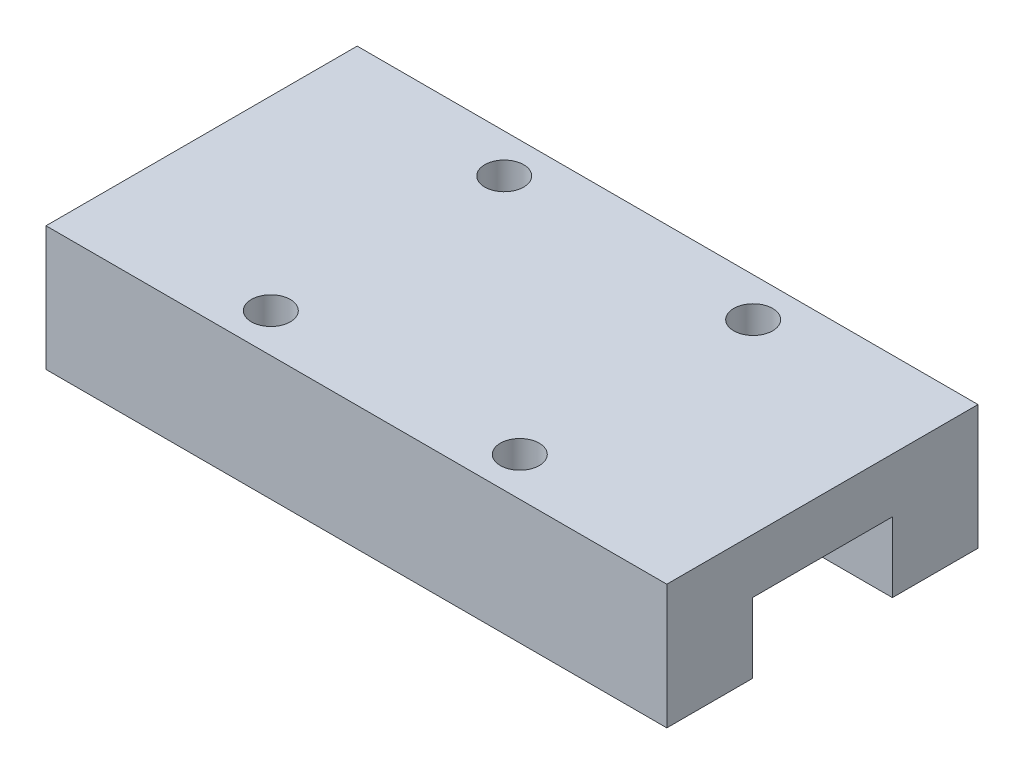
ISO-10303-21;
HEADER;
FILE_DESCRIPTION(('STEP AP214'),'2;1');
FILE_NAME('part.step','',(''),(''),'','','');
FILE_SCHEMA(('AUTOMOTIVE_DESIGN { 1 0 10303 214 1 1 1 1 }'));
ENDSEC;
DATA;
#1=APPLICATION_CONTEXT('core data for automotive mechanical design processes');
#2=APPLICATION_PROTOCOL_DEFINITION('international standard','automotive_design',2000,#1);
#3=PRODUCT_CONTEXT('',#1,'mechanical');
#4=PRODUCT('Part','Part','',(#3));
#5=PRODUCT_RELATED_PRODUCT_CATEGORY('part','',(#4));
#6=PRODUCT_DEFINITION_FORMATION('','',#4);
#7=PRODUCT_DEFINITION_CONTEXT('part definition',#1,'design');
#8=PRODUCT_DEFINITION('design','',#6,#7);
#9=PRODUCT_DEFINITION_SHAPE('','',#8);
#10=(LENGTH_UNIT() NAMED_UNIT(*) SI_UNIT(.MILLI.,.METRE.));
#11=(NAMED_UNIT(*) PLANE_ANGLE_UNIT() SI_UNIT($,.RADIAN.));
#12=(NAMED_UNIT(*) SI_UNIT($,.STERADIAN.) SOLID_ANGLE_UNIT());
#13=UNCERTAINTY_MEASURE_WITH_UNIT(LENGTH_MEASURE(1.E-05),#10,'distance_accuracy_value','');
#14=(GEOMETRIC_REPRESENTATION_CONTEXT(3) GLOBAL_UNCERTAINTY_ASSIGNED_CONTEXT((#13)) GLOBAL_UNIT_ASSIGNED_CONTEXT((#10,
#11,#12)) REPRESENTATION_CONTEXT('',''));
#15=CARTESIAN_POINT('',(0.,0.,0.));
#16=DIRECTION('',(0.,0.,1.));
#17=DIRECTION('',(1.,0.,0.));
#18=AXIS2_PLACEMENT_3D('',#15,#16,#17);
#19=CARTESIAN_POINT('',(19.95,0.,-5.5));
#20=DIRECTION('',(0.,1.,0.));
#21=DIRECTION('',(0.,0.,1.));
#22=AXIS2_PLACEMENT_3D('',#19,#20,#21);
#23=PLANE('',#22);
#24=DIRECTION('',(0.,0.,-1.));
#25=VECTOR('',#24,1.);
#26=CARTESIAN_POINT('',(-19.95,0.,-5.5));
#27=LINE('',#26,#25);
#28=CARTESIAN_POINT('',(-19.95,0.,0.));
#29=VERTEX_POINT('',#28);
#30=CARTESIAN_POINT('',(-19.95,0.,-5.5));
#31=VERTEX_POINT('',#30);
#32=EDGE_CURVE('E146',#29,#31,#27,.T.);
#33=ORIENTED_EDGE('',*,*,#32,.T.);
#34=DIRECTION('',(-1.,0.,0.));
#35=VECTOR('',#34,1.);
#36=CARTESIAN_POINT('',(19.95,0.,-5.5));
#37=LINE('',#36,#35);
#38=CARTESIAN_POINT('',(19.95,0.,-5.5));
#39=VERTEX_POINT('',#38);
#40=EDGE_CURVE('E11',#39,#31,#37,.T.);
#41=ORIENTED_EDGE('',*,*,#40,.F.);
#42=DIRECTION('',(0.,0.,-1.));
#43=VECTOR('',#42,1.);
#44=CARTESIAN_POINT('',(19.95,0.,-5.5));
#45=LINE('',#44,#43);
#46=CARTESIAN_POINT('',(19.95,0.,0.));
#47=VERTEX_POINT('',#46);
#48=EDGE_CURVE('E161',#47,#39,#45,.T.);
#49=ORIENTED_EDGE('',*,*,#48,.F.);
#50=DIRECTION('',(-1.,0.,0.));
#51=VECTOR('',#50,1.);
#52=CARTESIAN_POINT('',(19.95,0.,0.));
#53=LINE('',#52,#51);
#54=EDGE_CURVE('E142',#47,#29,#53,.T.);
#55=ORIENTED_EDGE('',*,*,#54,.T.);
#56=EDGE_LOOP('',(#33,#41,#49,#55));
#57=FACE_BOUND('',#56,.T.);
#58=ADVANCED_FACE('F47',(#57),#23,.F.);
#59=CARTESIAN_POINT('',(19.95,4.5,-5.5));
#60=DIRECTION('',(0.,0.,1.));
#61=DIRECTION('',(0.,-1.,0.));
#62=AXIS2_PLACEMENT_3D('',#59,#60,#61);
#63=PLANE('',#62);
#64=DIRECTION('',(0.,1.,0.));
#65=VECTOR('',#64,1.);
#66=CARTESIAN_POINT('',(-19.95,4.5,-5.5));
#67=LINE('',#66,#65);
#68=CARTESIAN_POINT('',(-19.95,4.5,-5.5));
#69=VERTEX_POINT('',#68);
#70=EDGE_CURVE('E149',#31,#69,#67,.T.);
#71=ORIENTED_EDGE('',*,*,#70,.T.);
#72=DIRECTION('',(-1.,0.,0.));
#73=VECTOR('',#72,1.);
#74=CARTESIAN_POINT('',(19.95,4.5,-5.5));
#75=LINE('',#74,#73);
#76=CARTESIAN_POINT('',(19.95,4.5,-5.5));
#77=VERTEX_POINT('',#76);
#78=EDGE_CURVE('E55',#77,#69,#75,.T.);
#79=ORIENTED_EDGE('',*,*,#78,.F.);
#80=DIRECTION('',(0.,1.,0.));
#81=VECTOR('',#80,1.);
#82=CARTESIAN_POINT('',(19.95,4.5,-5.5));
#83=LINE('',#82,#81);
#84=EDGE_CURVE('E107',#39,#77,#83,.T.);
#85=ORIENTED_EDGE('',*,*,#84,.F.);
#86=ORIENTED_EDGE('',*,*,#40,.T.);
#87=EDGE_LOOP('',(#71,#79,#85,#86));
#88=FACE_BOUND('',#87,.T.);
#89=ADVANCED_FACE('F248',(#88),#63,.F.);
#90=CARTESIAN_POINT('',(19.95,4.5,-14.5));
#91=DIRECTION('',(0.,1.,0.));
#92=DIRECTION('',(0.,0.,1.));
#93=AXIS2_PLACEMENT_3D('',#90,#91,#92);
#94=PLANE('',#93);
#95=DIRECTION('',(0.,0.,-1.));
#96=VECTOR('',#95,1.);
#97=CARTESIAN_POINT('',(-19.95,4.5,-14.5));
#98=LINE('',#97,#96);
#99=CARTESIAN_POINT('',(-19.95,4.5,-14.5));
#100=VERTEX_POINT('',#99);
#101=EDGE_CURVE('E152',#69,#100,#98,.T.);
#102=ORIENTED_EDGE('',*,*,#101,.T.);
#103=DIRECTION('',(-1.,0.,0.));
#104=VECTOR('',#103,1.);
#105=CARTESIAN_POINT('',(19.95,4.5,-14.5));
#106=LINE('',#105,#104);
#107=CARTESIAN_POINT('',(19.95,4.5,-14.5));
#108=VERTEX_POINT('',#107);
#109=EDGE_CURVE('E168',#108,#100,#106,.T.);
#110=ORIENTED_EDGE('',*,*,#109,.F.);
#111=DIRECTION('',(0.,0.,-1.));
#112=VECTOR('',#111,1.);
#113=CARTESIAN_POINT('',(19.95,4.5,-14.5));
#114=LINE('',#113,#112);
#115=EDGE_CURVE('E176',#77,#108,#114,.T.);
#116=ORIENTED_EDGE('',*,*,#115,.F.);
#117=ORIENTED_EDGE('',*,*,#78,.T.);
#118=EDGE_LOOP('',(#102,#110,#116,#117));
#119=FACE_BOUND('',#118,.T.);
#120=ADVANCED_FACE('F174',(#119),#94,.F.);
#121=CARTESIAN_POINT('',(19.95,0.,-14.5));
#122=DIRECTION('',(0.,0.,-1.));
#123=DIRECTION('',(-1.,0.,0.));
#124=AXIS2_PLACEMENT_3D('',#121,#122,#123);
#125=PLANE('',#124);
#126=DIRECTION('',(0.,-1.,0.));
#127=VECTOR('',#126,1.);
#128=CARTESIAN_POINT('',(-19.95,0.,-14.5));
#129=LINE('',#128,#127);
#130=CARTESIAN_POINT('',(-19.95,0.,-14.5));
#131=VERTEX_POINT('',#130);
#132=EDGE_CURVE('E154',#100,#131,#129,.T.);
#133=ORIENTED_EDGE('',*,*,#132,.T.);
#134=DIRECTION('',(-1.,0.,0.));
#135=VECTOR('',#134,1.);
#136=CARTESIAN_POINT('',(19.95,0.,-14.5));
#137=LINE('',#136,#135);
#138=CARTESIAN_POINT('',(19.95,0.,-14.5));
#139=VERTEX_POINT('',#138);
#140=EDGE_CURVE('E165',#139,#131,#137,.T.);
#141=ORIENTED_EDGE('',*,*,#140,.F.);
#142=DIRECTION('',(0.,-1.,0.));
#143=VECTOR('',#142,1.);
#144=CARTESIAN_POINT('',(19.95,0.,-14.5));
#145=LINE('',#144,#143);
#146=EDGE_CURVE('E188',#108,#139,#145,.T.);
#147=ORIENTED_EDGE('',*,*,#146,.F.);
#148=ORIENTED_EDGE('',*,*,#109,.T.);
#149=EDGE_LOOP('',(#133,#141,#147,#148));
#150=FACE_BOUND('',#149,.T.);
#151=ADVANCED_FACE('F184',(#150),#125,.F.);
#152=CARTESIAN_POINT('',(19.95,0.,-20.));
#153=DIRECTION('',(0.,1.,0.));
#154=DIRECTION('',(0.,0.,1.));
#155=AXIS2_PLACEMENT_3D('',#152,#153,#154);
#156=PLANE('',#155);
#157=DIRECTION('',(0.,0.,-1.));
#158=VECTOR('',#157,1.);
#159=CARTESIAN_POINT('',(-19.95,0.,-20.));
#160=LINE('',#159,#158);
#161=CARTESIAN_POINT('',(-19.95,0.,-20.));
#162=VERTEX_POINT('',#161);
#163=EDGE_CURVE('E156',#131,#162,#160,.T.);
#164=ORIENTED_EDGE('',*,*,#163,.T.);
#165=DIRECTION('',(-1.,0.,0.));
#166=VECTOR('',#165,1.);
#167=CARTESIAN_POINT('',(19.95,0.,-20.));
#168=LINE('',#167,#166);
#169=CARTESIAN_POINT('',(19.95,0.,-20.));
#170=VERTEX_POINT('',#169);
#171=EDGE_CURVE('E137',#170,#162,#168,.T.);
#172=ORIENTED_EDGE('',*,*,#171,.F.);
#173=DIRECTION('',(0.,0.,-1.));
#174=VECTOR('',#173,1.);
#175=CARTESIAN_POINT('',(19.95,0.,-20.));
#176=LINE('',#175,#174);
#177=EDGE_CURVE('E128',#139,#170,#176,.T.);
#178=ORIENTED_EDGE('',*,*,#177,.F.);
#179=ORIENTED_EDGE('',*,*,#140,.T.);
#180=EDGE_LOOP('',(#164,#172,#178,#179));
#181=FACE_BOUND('',#180,.T.);
#182=ADVANCED_FACE('F187',(#181),#156,.F.);
#183=CARTESIAN_POINT('',(19.95,8.,-20.));
#184=DIRECTION('',(0.,0.,1.));
#185=DIRECTION('',(0.,-1.,0.));
#186=AXIS2_PLACEMENT_3D('',#183,#184,#185);
#187=PLANE('',#186);
#188=DIRECTION('',(0.,1.,0.));
#189=VECTOR('',#188,1.);
#190=CARTESIAN_POINT('',(-19.95,8.,-20.));
#191=LINE('',#190,#189);
#192=CARTESIAN_POINT('',(-19.95,8.,-20.));
#193=VERTEX_POINT('',#192);
#194=EDGE_CURVE('E136',#162,#193,#191,.T.);
#195=ORIENTED_EDGE('',*,*,#194,.T.);
#196=DIRECTION('',(-1.,0.,0.));
#197=VECTOR('',#196,1.);
#198=CARTESIAN_POINT('',(19.95,8.,-20.));
#199=LINE('',#198,#197);
#200=CARTESIAN_POINT('',(19.95,8.,-20.));
#201=VERTEX_POINT('',#200);
#202=EDGE_CURVE('E133',#201,#193,#199,.T.);
#203=ORIENTED_EDGE('',*,*,#202,.F.);
#204=DIRECTION('',(0.,1.,0.));
#205=VECTOR('',#204,1.);
#206=CARTESIAN_POINT('',(19.95,8.,-20.));
#207=LINE('',#206,#205);
#208=EDGE_CURVE('E122',#170,#201,#207,.T.);
#209=ORIENTED_EDGE('',*,*,#208,.F.);
#210=ORIENTED_EDGE('',*,*,#171,.T.);
#211=EDGE_LOOP('',(#195,#203,#209,#210));
#212=FACE_BOUND('',#211,.T.);
#213=ADVANCED_FACE('F134',(#212),#187,.F.);
#214=CARTESIAN_POINT('',(19.95,8.,0.));
#215=DIRECTION('',(0.,-1.,0.));
#216=DIRECTION('',(0.,0.,-1.));
#217=AXIS2_PLACEMENT_3D('',#214,#215,#216);
#218=PLANE('',#217);
#219=CARTESIAN_POINT('',(-8.,8.,-17.5));
#220=DIRECTION('',(0.,1.,0.));
#221=DIRECTION('',(0.,0.,1.));
#222=AXIS2_PLACEMENT_3D('',#219,#220,#221);
#223=CIRCLE('',#222,1.25);
#224=CARTESIAN_POINT('',(-8.,8.,-16.25));
#225=VERTEX_POINT('',#224);
#226=EDGE_CURVE('E214',#225,#225,#223,.T.);
#227=ORIENTED_EDGE('',*,*,#226,.F.);
#228=EDGE_LOOP('',(#227));
#229=FACE_BOUND('',#228,.T.);
#230=CARTESIAN_POINT('',(8.,8.,-17.5));
#231=DIRECTION('',(0.,1.,0.));
#232=DIRECTION('',(0.,0.,1.));
#233=AXIS2_PLACEMENT_3D('',#230,#231,#232);
#234=CIRCLE('',#233,1.25);
#235=CARTESIAN_POINT('',(8.,8.,-16.25));
#236=VERTEX_POINT('',#235);
#237=EDGE_CURVE('E208',#236,#236,#234,.T.);
#238=ORIENTED_EDGE('',*,*,#237,.F.);
#239=EDGE_LOOP('',(#238));
#240=FACE_BOUND('',#239,.T.);
#241=CARTESIAN_POINT('',(8.,8.,-2.5));
#242=DIRECTION('',(0.,1.,0.));
#243=DIRECTION('',(0.,0.,1.));
#244=AXIS2_PLACEMENT_3D('',#241,#242,#243);
#245=CIRCLE('',#244,1.25);
#246=CARTESIAN_POINT('',(8.,8.,-1.25));
#247=VERTEX_POINT('',#246);
#248=EDGE_CURVE('E202',#247,#247,#245,.T.);
#249=ORIENTED_EDGE('',*,*,#248,.F.);
#250=EDGE_LOOP('',(#249));
#251=FACE_BOUND('',#250,.T.);
#252=CARTESIAN_POINT('',(-8.,8.,-2.5));
#253=DIRECTION('',(0.,1.,0.));
#254=DIRECTION('',(0.,0.,1.));
#255=AXIS2_PLACEMENT_3D('',#252,#253,#254);
#256=CIRCLE('',#255,1.25);
#257=CARTESIAN_POINT('',(-8.,8.,-1.25));
#258=VERTEX_POINT('',#257);
#259=EDGE_CURVE('E196',#258,#258,#256,.T.);
#260=ORIENTED_EDGE('',*,*,#259,.F.);
#261=EDGE_LOOP('',(#260));
#262=FACE_BOUND('',#261,.T.);
#263=DIRECTION('',(0.,0.,1.));
#264=VECTOR('',#263,1.);
#265=CARTESIAN_POINT('',(-19.95,8.,0.));
#266=LINE('',#265,#264);
#267=CARTESIAN_POINT('',(-19.95,8.,0.));
#268=VERTEX_POINT('',#267);
#269=EDGE_CURVE('E93',#193,#268,#266,.T.);
#270=ORIENTED_EDGE('',*,*,#269,.T.);
#271=DIRECTION('',(-1.,0.,0.));
#272=VECTOR('',#271,1.);
#273=CARTESIAN_POINT('',(19.95,8.,0.));
#274=LINE('',#273,#272);
#275=CARTESIAN_POINT('',(19.95,8.,0.));
#276=VERTEX_POINT('',#275);
#277=EDGE_CURVE('E138',#276,#268,#274,.T.);
#278=ORIENTED_EDGE('',*,*,#277,.F.);
#279=DIRECTION('',(0.,0.,1.));
#280=VECTOR('',#279,1.);
#281=CARTESIAN_POINT('',(19.95,8.,0.));
#282=LINE('',#281,#280);
#283=EDGE_CURVE('E126',#201,#276,#282,.T.);
#284=ORIENTED_EDGE('',*,*,#283,.F.);
#285=ORIENTED_EDGE('',*,*,#202,.T.);
#286=EDGE_LOOP('',(#270,#278,#284,#285));
#287=FACE_BOUND('',#286,.T.);
#288=ADVANCED_FACE('F140',(#229,#240,#251,#262,#287),#218,.F.);
#289=CARTESIAN_POINT('',(19.95,0.,0.));
#290=DIRECTION('',(0.,0.,-1.));
#291=DIRECTION('',(-1.,0.,0.));
#292=AXIS2_PLACEMENT_3D('',#289,#290,#291);
#293=PLANE('',#292);
#294=DIRECTION('',(0.,-1.,0.));
#295=VECTOR('',#294,1.);
#296=CARTESIAN_POINT('',(-19.95,0.,0.));
#297=LINE('',#296,#295);
#298=EDGE_CURVE('E99',#268,#29,#297,.T.);
#299=ORIENTED_EDGE('',*,*,#298,.T.);
#300=ORIENTED_EDGE('',*,*,#54,.F.);
#301=DIRECTION('',(0.,-1.,0.));
#302=VECTOR('',#301,1.);
#303=CARTESIAN_POINT('',(19.95,0.,0.));
#304=LINE('',#303,#302);
#305=EDGE_CURVE('E63',#276,#47,#304,.T.);
#306=ORIENTED_EDGE('',*,*,#305,.F.);
#307=ORIENTED_EDGE('',*,*,#277,.T.);
#308=EDGE_LOOP('',(#299,#300,#306,#307));
#309=FACE_BOUND('',#308,.T.);
#310=ADVANCED_FACE('F222',(#309),#293,.F.);
#311=CARTESIAN_POINT('',(19.95,0.,0.));
#312=DIRECTION('',(-1.,0.,0.));
#313=DIRECTION('',(0.,0.,1.));
#314=AXIS2_PLACEMENT_3D('',#311,#312,#313);
#315=PLANE('',#314);
#316=ORIENTED_EDGE('',*,*,#48,.T.);
#317=ORIENTED_EDGE('',*,*,#84,.T.);
#318=ORIENTED_EDGE('',*,*,#115,.T.);
#319=ORIENTED_EDGE('',*,*,#146,.T.);
#320=ORIENTED_EDGE('',*,*,#177,.T.);
#321=ORIENTED_EDGE('',*,*,#208,.T.);
#322=ORIENTED_EDGE('',*,*,#283,.T.);
#323=ORIENTED_EDGE('',*,*,#305,.T.);
#324=EDGE_LOOP('',(#316,#317,#318,#319,#320,#321,#322,#323));
#325=FACE_BOUND('',#324,.T.);
#326=ADVANCED_FACE('F124',(#325),#315,.F.);
#327=CARTESIAN_POINT('',(-19.95,0.,0.));
#328=DIRECTION('',(-1.,0.,0.));
#329=DIRECTION('',(0.,0.,1.));
#330=AXIS2_PLACEMENT_3D('',#327,#328,#329);
#331=PLANE('',#330);
#332=ORIENTED_EDGE('',*,*,#32,.F.);
#333=ORIENTED_EDGE('',*,*,#298,.F.);
#334=ORIENTED_EDGE('',*,*,#269,.F.);
#335=ORIENTED_EDGE('',*,*,#194,.F.);
#336=ORIENTED_EDGE('',*,*,#163,.F.);
#337=ORIENTED_EDGE('',*,*,#132,.F.);
#338=ORIENTED_EDGE('',*,*,#101,.F.);
#339=ORIENTED_EDGE('',*,*,#70,.F.);
#340=EDGE_LOOP('',(#332,#333,#334,#335,#336,#337,#338,#339));
#341=FACE_BOUND('',#340,.T.);
#342=ADVANCED_FACE('F180',(#341),#331,.T.);
#343=CARTESIAN_POINT('',(-8.,3.5,-2.5));
#344=DIRECTION('',(0.,1.,0.));
#345=DIRECTION('',(0.,0.,1.));
#346=AXIS2_PLACEMENT_3D('',#343,#344,#345);
#347=CONICAL_SURFACE('',#346,1.25,1.02974425867665);
#348=CARTESIAN_POINT('',(-8.,2.74892422621555,-2.5));
#349=VERTEX_POINT('',#348);
#350=VERTEX_LOOP('',#349);
#351=FACE_BOUND('',#350,.T.);
#352=CARTESIAN_POINT('',(-8.,3.5,-2.5));
#353=DIRECTION('',(0.,1.,0.));
#354=DIRECTION('',(0.,0.,1.));
#355=AXIS2_PLACEMENT_3D('',#352,#353,#354);
#356=CIRCLE('',#355,1.25);
#357=CARTESIAN_POINT('',(-8.,3.5,-1.25));
#358=VERTEX_POINT('',#357);
#359=EDGE_CURVE('E150',#358,#358,#356,.T.);
#360=ORIENTED_EDGE('',*,*,#359,.T.);
#361=EDGE_LOOP('',(#360));
#362=FACE_BOUND('',#361,.T.);
#363=ADVANCED_FACE('F233',(#351,#362),#347,.F.);
#364=CARTESIAN_POINT('',(-8.,8.,-2.5));
#365=DIRECTION('',(0.,1.,0.));
#366=DIRECTION('',(0.,0.,1.));
#367=AXIS2_PLACEMENT_3D('',#364,#365,#366);
#368=CYLINDRICAL_SURFACE('',#367,1.25);
#369=ORIENTED_EDGE('',*,*,#359,.F.);
#370=EDGE_LOOP('',(#369));
#371=FACE_BOUND('',#370,.T.);
#372=ORIENTED_EDGE('',*,*,#259,.T.);
#373=EDGE_LOOP('',(#372));
#374=FACE_BOUND('',#373,.T.);
#375=ADVANCED_FACE('F230',(#371,#374),#368,.F.);
#376=CARTESIAN_POINT('',(8.,3.5,-2.5));
#377=DIRECTION('',(0.,1.,0.));
#378=DIRECTION('',(0.,0.,1.));
#379=AXIS2_PLACEMENT_3D('',#376,#377,#378);
#380=CONICAL_SURFACE('',#379,1.25,1.02974425867665);
#381=CARTESIAN_POINT('',(8.,2.74892422621555,-2.5));
#382=VERTEX_POINT('',#381);
#383=VERTEX_LOOP('',#382);
#384=FACE_BOUND('',#383,.T.);
#385=CARTESIAN_POINT('',(8.,3.5,-2.5));
#386=DIRECTION('',(0.,1.,0.));
#387=DIRECTION('',(0.,0.,1.));
#388=AXIS2_PLACEMENT_3D('',#385,#386,#387);
#389=CIRCLE('',#388,1.25);
#390=CARTESIAN_POINT('',(8.,3.5,-1.25));
#391=VERTEX_POINT('',#390);
#392=EDGE_CURVE('E199',#391,#391,#389,.T.);
#393=ORIENTED_EDGE('',*,*,#392,.T.);
#394=EDGE_LOOP('',(#393));
#395=FACE_BOUND('',#394,.T.);
#396=ADVANCED_FACE('F232',(#384,#395),#380,.F.);
#397=CARTESIAN_POINT('',(8.,8.,-2.5));
#398=DIRECTION('',(0.,1.,0.));
#399=DIRECTION('',(0.,0.,1.));
#400=AXIS2_PLACEMENT_3D('',#397,#398,#399);
#401=CYLINDRICAL_SURFACE('',#400,1.25);
#402=ORIENTED_EDGE('',*,*,#392,.F.);
#403=EDGE_LOOP('',(#402));
#404=FACE_BOUND('',#403,.T.);
#405=ORIENTED_EDGE('',*,*,#248,.T.);
#406=EDGE_LOOP('',(#405));
#407=FACE_BOUND('',#406,.T.);
#408=ADVANCED_FACE('F240',(#404,#407),#401,.F.);
#409=CARTESIAN_POINT('',(8.,3.5,-17.5));
#410=DIRECTION('',(0.,1.,0.));
#411=DIRECTION('',(0.,0.,1.));
#412=AXIS2_PLACEMENT_3D('',#409,#410,#411);
#413=CONICAL_SURFACE('',#412,1.25,1.02974425867665);
#414=CARTESIAN_POINT('',(8.,2.74892422621555,-17.5));
#415=VERTEX_POINT('',#414);
#416=VERTEX_LOOP('',#415);
#417=FACE_BOUND('',#416,.T.);
#418=CARTESIAN_POINT('',(8.,3.5,-17.5));
#419=DIRECTION('',(0.,1.,0.));
#420=DIRECTION('',(0.,0.,1.));
#421=AXIS2_PLACEMENT_3D('',#418,#419,#420);
#422=CIRCLE('',#421,1.25);
#423=CARTESIAN_POINT('',(8.,3.5,-16.25));
#424=VERTEX_POINT('',#423);
#425=EDGE_CURVE('E205',#424,#424,#422,.T.);
#426=ORIENTED_EDGE('',*,*,#425,.T.);
#427=EDGE_LOOP('',(#426));
#428=FACE_BOUND('',#427,.T.);
#429=ADVANCED_FACE('F322',(#417,#428),#413,.F.);
#430=CARTESIAN_POINT('',(8.,8.,-17.5));
#431=DIRECTION('',(0.,1.,0.));
#432=DIRECTION('',(0.,0.,1.));
#433=AXIS2_PLACEMENT_3D('',#430,#431,#432);
#434=CYLINDRICAL_SURFACE('',#433,1.25);
#435=ORIENTED_EDGE('',*,*,#425,.F.);
#436=EDGE_LOOP('',(#435));
#437=FACE_BOUND('',#436,.T.);
#438=ORIENTED_EDGE('',*,*,#237,.T.);
#439=EDGE_LOOP('',(#438));
#440=FACE_BOUND('',#439,.T.);
#441=ADVANCED_FACE('F331',(#437,#440),#434,.F.);
#442=CARTESIAN_POINT('',(-8.,3.5,-17.5));
#443=DIRECTION('',(0.,1.,0.));
#444=DIRECTION('',(0.,0.,1.));
#445=AXIS2_PLACEMENT_3D('',#442,#443,#444);
#446=CONICAL_SURFACE('',#445,1.25,1.02974425867665);
#447=CARTESIAN_POINT('',(-8.,2.74892422621555,-17.5));
#448=VERTEX_POINT('',#447);
#449=VERTEX_LOOP('',#448);
#450=FACE_BOUND('',#449,.T.);
#451=CARTESIAN_POINT('',(-8.,3.5,-17.5));
#452=DIRECTION('',(0.,1.,0.));
#453=DIRECTION('',(0.,0.,1.));
#454=AXIS2_PLACEMENT_3D('',#451,#452,#453);
#455=CIRCLE('',#454,1.25);
#456=CARTESIAN_POINT('',(-8.,3.5,-16.25));
#457=VERTEX_POINT('',#456);
#458=EDGE_CURVE('E211',#457,#457,#455,.T.);
#459=ORIENTED_EDGE('',*,*,#458,.T.);
#460=EDGE_LOOP('',(#459));
#461=FACE_BOUND('',#460,.T.);
#462=ADVANCED_FACE('F340',(#450,#461),#446,.F.);
#463=CARTESIAN_POINT('',(-8.,8.,-17.5));
#464=DIRECTION('',(0.,1.,0.));
#465=DIRECTION('',(0.,0.,1.));
#466=AXIS2_PLACEMENT_3D('',#463,#464,#465);
#467=CYLINDRICAL_SURFACE('',#466,1.25);
#468=ORIENTED_EDGE('',*,*,#458,.F.);
#469=EDGE_LOOP('',(#468));
#470=FACE_BOUND('',#469,.T.);
#471=ORIENTED_EDGE('',*,*,#226,.T.);
#472=EDGE_LOOP('',(#471));
#473=FACE_BOUND('',#472,.T.);
#474=ADVANCED_FACE('F218',(#470,#473),#467,.F.);
#475=CLOSED_SHELL('',(#58,#89,#120,#151,#182,#213,#288,#310,#326,#342,#363,#375,#396,#408,#429,
#441,#462,#474));
#476=MANIFOLD_SOLID_BREP('B2',#475);
#477=ADVANCED_BREP_SHAPE_REPRESENTATION('',(#18,#476),#14);
#478=SHAPE_DEFINITION_REPRESENTATION(#9,#477);
ENDSEC;
END-ISO-10303-21;
